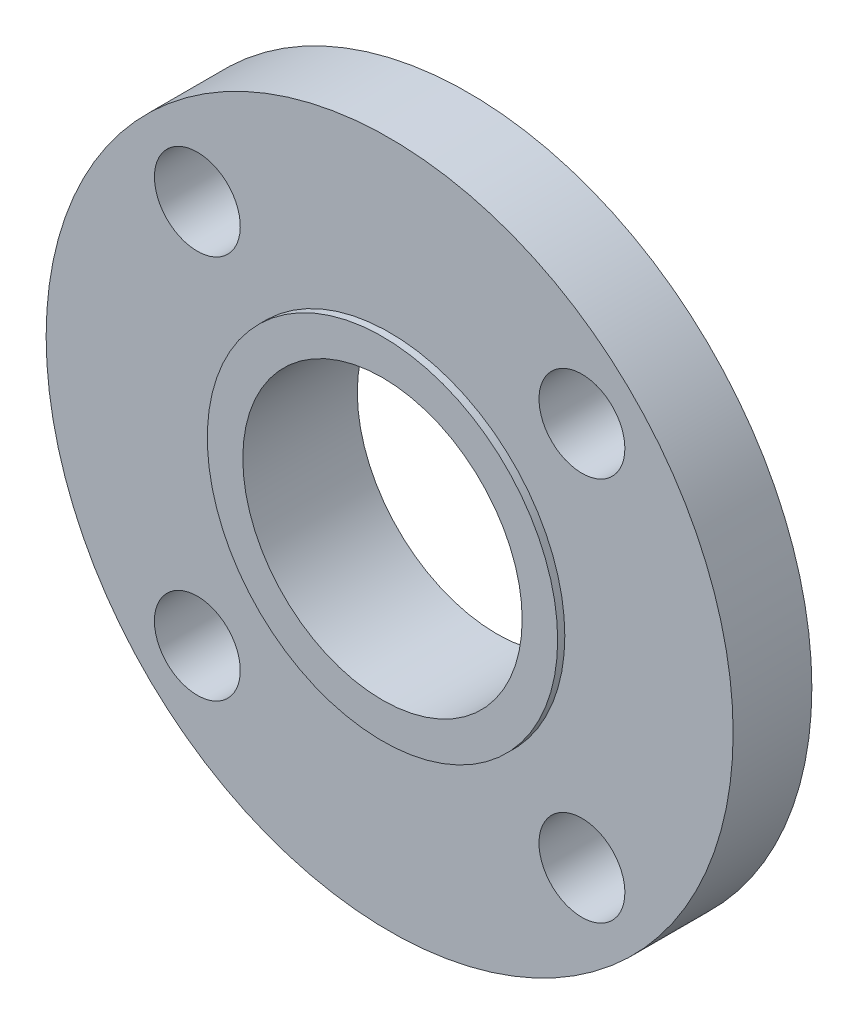
ISO-10303-21;
HEADER;
FILE_DESCRIPTION(('STEP AP214'),'2;1');
FILE_NAME('part.step','',(''),(''),'','','');
FILE_SCHEMA(('AUTOMOTIVE_DESIGN { 1 0 10303 214 1 1 1 1 }'));
ENDSEC;
DATA;
#1=APPLICATION_CONTEXT('core data for automotive mechanical design processes');
#2=APPLICATION_PROTOCOL_DEFINITION('international standard','automotive_design',2000,#1);
#3=PRODUCT_CONTEXT('',#1,'mechanical');
#4=PRODUCT('Part','Part','',(#3));
#5=PRODUCT_RELATED_PRODUCT_CATEGORY('part','',(#4));
#6=PRODUCT_DEFINITION_FORMATION('','',#4);
#7=PRODUCT_DEFINITION_CONTEXT('part definition',#1,'design');
#8=PRODUCT_DEFINITION('design','',#6,#7);
#9=PRODUCT_DEFINITION_SHAPE('','',#8);
#10=(LENGTH_UNIT() NAMED_UNIT(*) SI_UNIT(.MILLI.,.METRE.));
#11=(NAMED_UNIT(*) PLANE_ANGLE_UNIT() SI_UNIT($,.RADIAN.));
#12=(NAMED_UNIT(*) SI_UNIT($,.STERADIAN.) SOLID_ANGLE_UNIT());
#13=UNCERTAINTY_MEASURE_WITH_UNIT(LENGTH_MEASURE(1.E-05),#10,'distance_accuracy_value','');
#14=(GEOMETRIC_REPRESENTATION_CONTEXT(3) GLOBAL_UNCERTAINTY_ASSIGNED_CONTEXT((#13)) GLOBAL_UNIT_ASSIGNED_CONTEXT((#10,
#11,#12)) REPRESENTATION_CONTEXT('',''));
#15=CARTESIAN_POINT('',(0.,0.,0.));
#16=DIRECTION('',(0.,0.,1.));
#17=DIRECTION('',(1.,0.,0.));
#18=AXIS2_PLACEMENT_3D('',#15,#16,#17);
#19=CARTESIAN_POINT('',(0.,0.,-25.4));
#20=DIRECTION('',(0.,0.,1.));
#21=DIRECTION('',(1.,0.,0.));
#22=AXIS2_PLACEMENT_3D('',#19,#20,#21);
#23=CYLINDRICAL_SURFACE('',#22,38.862);
#24=CARTESIAN_POINT('',(0.,0.,-1.5875));
#25=DIRECTION('',(0.,0.,1.));
#26=DIRECTION('',(1.,0.,0.));
#27=AXIS2_PLACEMENT_3D('',#24,#25,#26);
#28=CIRCLE('',#27,38.862);
#29=CARTESIAN_POINT('',(38.862,0.,-1.5875));
#30=VERTEX_POINT('',#29);
#31=EDGE_CURVE('E10',#30,#30,#28,.F.);
#32=ORIENTED_EDGE('',*,*,#31,.F.);
#33=EDGE_LOOP('',(#32));
#34=FACE_BOUND('',#33,.T.);
#35=CARTESIAN_POINT('',(0.,0.,0.));
#36=DIRECTION('',(0.,0.,1.));
#37=DIRECTION('',(1.,0.,0.));
#38=AXIS2_PLACEMENT_3D('',#35,#36,#37);
#39=CIRCLE('',#38,38.862);
#40=CARTESIAN_POINT('',(38.862,0.,0.));
#41=VERTEX_POINT('',#40);
#42=EDGE_CURVE('E47',#41,#41,#39,.T.);
#43=ORIENTED_EDGE('',*,*,#42,.F.);
#44=EDGE_LOOP('',(#43));
#45=FACE_BOUND('',#44,.T.);
#46=ADVANCED_FACE('F35',(#34,#45),#23,.T.);
#47=CARTESIAN_POINT('',(0.,0.,0.));
#48=DIRECTION('',(0.,0.,1.));
#49=DIRECTION('',(1.,0.,0.));
#50=AXIS2_PLACEMENT_3D('',#47,#48,#49);
#51=PLANE('',#50);
#52=CARTESIAN_POINT('',(0.,0.,0.));
#53=DIRECTION('',(0.,0.,1.));
#54=DIRECTION('',(1.,0.,0.));
#55=AXIS2_PLACEMENT_3D('',#52,#53,#54);
#56=CIRCLE('',#55,30.988);
#57=CARTESIAN_POINT('',(30.988,0.,0.));
#58=VERTEX_POINT('',#57);
#59=EDGE_CURVE('E55',#58,#58,#56,.T.);
#60=ORIENTED_EDGE('',*,*,#59,.F.);
#61=EDGE_LOOP('',(#60));
#62=FACE_BOUND('',#61,.T.);
#63=ORIENTED_EDGE('',*,*,#42,.T.);
#64=EDGE_LOOP('',(#63));
#65=FACE_BOUND('',#64,.T.);
#66=ADVANCED_FACE('F91',(#62,#65),#51,.T.);
#67=CARTESIAN_POINT('',(0.,0.,-234.57614690566));
#68=DIRECTION('',(0.,0.,1.));
#69=DIRECTION('',(1.,0.,0.));
#70=AXIS2_PLACEMENT_3D('',#67,#68,#69);
#71=CYLINDRICAL_SURFACE('',#70,76.2);
#72=CARTESIAN_POINT('',(0.,0.,-19.05));
#73=DIRECTION('',(0.,0.,1.));
#74=DIRECTION('',(1.,0.,0.));
#75=AXIS2_PLACEMENT_3D('',#72,#73,#74);
#76=CIRCLE('',#75,76.2);
#77=CARTESIAN_POINT('',(76.2,0.,-19.05));
#78=VERTEX_POINT('',#77);
#79=EDGE_CURVE('E59',#78,#78,#76,.F.);
#80=CARTESIAN_POINT('',(0.,0.,-1.5875));
#81=DIRECTION('',(0.,0.,1.));
#82=DIRECTION('',(1.,0.,0.));
#83=AXIS2_PLACEMENT_3D('',#80,#81,#82);
#84=CIRCLE('',#83,76.2);
#85=CARTESIAN_POINT('',(76.2,0.,-1.58750000000002));
#86=VERTEX_POINT('',#85);
#87=EDGE_CURVE('E54',#86,#86,#84,.T.);
#88=CARTESIAN_POINT('',(76.2,0.,-19.05));
#89=CARTESIAN_POINT('',(76.2,0.,-18.8680989583333));
#90=CARTESIAN_POINT('',(76.2,0.,-18.6861979166667));
#91=CARTESIAN_POINT('',(76.2,0.,-18.3223958333333));
#92=CARTESIAN_POINT('',(76.2,0.,-18.1404947916667));
#93=CARTESIAN_POINT('',(76.2,0.,-17.7766927083333));
#94=CARTESIAN_POINT('',(76.2,0.,-17.5947916666667));
#95=CARTESIAN_POINT('',(76.2,0.,-17.2309895833333));
#96=CARTESIAN_POINT('',(76.2,0.,-17.0490885416667));
#97=CARTESIAN_POINT('',(76.2,0.,-16.6852864583333));
#98=CARTESIAN_POINT('',(76.2,0.,-16.5033854166667));
#99=CARTESIAN_POINT('',(76.2,0.,-16.1395833333333));
#100=CARTESIAN_POINT('',(76.2,0.,-15.9576822916667));
#101=CARTESIAN_POINT('',(76.2,0.,-15.5938802083333));
#102=CARTESIAN_POINT('',(76.2,0.,-15.4119791666667));
#103=CARTESIAN_POINT('',(76.2,0.,-15.0481770833334));
#104=CARTESIAN_POINT('',(76.2,0.,-14.8662760416667));
#105=CARTESIAN_POINT('',(76.2,0.,-14.5024739583334));
#106=CARTESIAN_POINT('',(76.2,0.,-14.3205729166667));
#107=CARTESIAN_POINT('',(76.2,0.,-13.9567708333333));
#108=CARTESIAN_POINT('',(76.2,0.,-13.7748697916667));
#109=CARTESIAN_POINT('',(76.2,0.,-13.4110677083334));
#110=CARTESIAN_POINT('',(76.2,0.,-13.2291666666667));
#111=CARTESIAN_POINT('',(76.2,0.,-12.8653645833334));
#112=CARTESIAN_POINT('',(76.2,0.,-12.6834635416667));
#113=CARTESIAN_POINT('',(76.2,0.,-12.3196614583333));
#114=CARTESIAN_POINT('',(76.2,0.,-12.1377604166667));
#115=CARTESIAN_POINT('',(76.2,0.,-11.7739583333334));
#116=CARTESIAN_POINT('',(76.2,0.,-11.5920572916667));
#117=CARTESIAN_POINT('',(76.2,0.,-11.2282552083334));
#118=CARTESIAN_POINT('',(76.2,0.,-11.0463541666667));
#119=CARTESIAN_POINT('',(76.2,0.,-10.6825520833333));
#120=CARTESIAN_POINT('',(76.2,0.,-10.5006510416667));
#121=CARTESIAN_POINT('',(76.2,0.,-10.1368489583334));
#122=CARTESIAN_POINT('',(76.2,0.,-9.95494791666669));
#123=CARTESIAN_POINT('',(76.2,0.,-9.59114583333335));
#124=CARTESIAN_POINT('',(76.2,0.,-9.40924479166668));
#125=CARTESIAN_POINT('',(76.2,0.,-9.04544270833334));
#126=CARTESIAN_POINT('',(76.2,0.,-8.86354166666668));
#127=CARTESIAN_POINT('',(76.2,0.,-8.49973958333335));
#128=CARTESIAN_POINT('',(76.2,0.,-8.31783854166669));
#129=CARTESIAN_POINT('',(76.2,0.,-7.95403645833335));
#130=CARTESIAN_POINT('',(76.2,0.,-7.77213541666668));
#131=CARTESIAN_POINT('',(76.2,0.,-7.40833333333334));
#132=CARTESIAN_POINT('',(76.2,0.,-7.22643229166668));
#133=CARTESIAN_POINT('',(76.2,0.,-6.86263020833335));
#134=CARTESIAN_POINT('',(76.2,0.,-6.68072916666669));
#135=CARTESIAN_POINT('',(76.2,0.,-6.31692708333335));
#136=CARTESIAN_POINT('',(76.2,0.,-6.13502604166668));
#137=CARTESIAN_POINT('',(76.2,0.,-5.77122395833334));
#138=CARTESIAN_POINT('',(76.2,0.,-5.58932291666668));
#139=CARTESIAN_POINT('',(76.2,0.,-5.22552083333335));
#140=CARTESIAN_POINT('',(76.2,0.,-5.04361979166669));
#141=CARTESIAN_POINT('',(76.2,0.,-4.67981770833336));
#142=CARTESIAN_POINT('',(76.2,0.,-4.49791666666669));
#143=CARTESIAN_POINT('',(76.2,0.,-4.13411458333336));
#144=CARTESIAN_POINT('',(76.2,0.,-3.95221354166668));
#145=CARTESIAN_POINT('',(76.2,0.,-3.58841145833335));
#146=CARTESIAN_POINT('',(76.2,0.,-3.40651041666668));
#147=CARTESIAN_POINT('',(76.2,0.,-3.04270833333336));
#148=CARTESIAN_POINT('',(76.2,0.,-2.86080729166669));
#149=CARTESIAN_POINT('',(76.2,0.,-2.49700520833336));
#150=CARTESIAN_POINT('',(76.2,0.,-2.31510416666668));
#151=CARTESIAN_POINT('',(76.2,0.,-1.95130208333335));
#152=CARTESIAN_POINT('',(76.2,0.,-1.76940104166668));
#153=CARTESIAN_POINT('',(76.2,0.,-1.58750000000002));
#154=B_SPLINE_CURVE_WITH_KNOTS('',3,(#88,#89,#90,#91,#92,#93,#94,#95,#96,#97,#98,#99,#100,#101,
#102,#103,#104,#105,#106,#107,#108,#109,#110,#111,#112,#113,#114,#115,#116,#117,#118,#119,#120,
#121,#122,#123,#124,#125,#126,#127,#128,#129,#130,#131,#132,#133,#134,#135,#136,#137,#138,#139,
#140,#141,#142,#143,#144,#145,#146,#147,#148,#149,#150,#151,#152,#153),.UNSPECIFIED.,.F.,.F.,(4,
2,2,2,2,2,2,2,2,2,2,2,2,2,2,2,2,2,2,2,2,2,2,2,2,2,2,2,2,2,2,2,4),(0.,0.545703124999991,
1.09140625000001,1.637109375,2.18281249999999,2.72851562500001,3.27421875,3.81992187499999,
4.36562499999998,4.911328125,5.45703124999999,6.00273437499999,6.5484375,7.094140625,
7.63984374999999,8.18554687500001,8.73125,9.27695312499999,9.82265625,10.368359375,10.9140625,
11.459765625,12.00546875,12.551171875,13.096875,13.642578125,14.18828125,14.733984375,
15.2796875,15.825390625,16.37109375,16.916796875,17.4625),.UNSPECIFIED.);
#155=EDGE_CURVE('BSEAM88',#78,#86,#154,.T.);
#156=ORIENTED_EDGE('',*,*,#79,.F.);
#157=ORIENTED_EDGE('',*,*,#87,.F.);
#158=ORIENTED_EDGE('',*,*,#155,.T.);
#159=ORIENTED_EDGE('',*,*,#155,.F.);
#160=EDGE_LOOP('',(#156,#158,#157,#159));
#161=FACE_BOUND('',#160,.T.);
#162=ADVANCED_FACE('F88',(#161),#71,.T.);
#163=CARTESIAN_POINT('',(0.,0.,-1.5875));
#164=DIRECTION('',(0.,0.,1.));
#165=DIRECTION('',(1.,0.,0.));
#166=AXIS2_PLACEMENT_3D('',#163,#164,#165);
#167=PLANE('',#166);
#168=CARTESIAN_POINT('',(42.6562165750788,-42.6562165750781,-1.5875));
#169=DIRECTION('',(0.,0.,1.));
#170=DIRECTION('',(0.,-1.,0.));
#171=AXIS2_PLACEMENT_3D('',#168,#169,#170);
#172=CIRCLE('',#171,9.525);
#173=CARTESIAN_POINT('',(42.6562165750789,-52.1812165750781,-1.5875));
#174=VERTEX_POINT('',#173);
#175=EDGE_CURVE('E249',#174,#174,#172,.T.);
#176=ORIENTED_EDGE('',*,*,#175,.F.);
#177=EDGE_LOOP('',(#176));
#178=FACE_BOUND('',#177,.T.);
#179=CARTESIAN_POINT('',(-42.6562165750782,-42.6562165750787,-1.5875));
#180=DIRECTION('',(0.,0.,1.));
#181=DIRECTION('',(-1.,0.,0.));
#182=AXIS2_PLACEMENT_3D('',#179,#180,#181);
#183=CIRCLE('',#182,9.525);
#184=CARTESIAN_POINT('',(-52.1812165750782,-42.6562165750788,-1.5875));
#185=VERTEX_POINT('',#184);
#186=EDGE_CURVE('E243',#185,#185,#183,.T.);
#187=ORIENTED_EDGE('',*,*,#186,.F.);
#188=EDGE_LOOP('',(#187));
#189=FACE_BOUND('',#188,.T.);
#190=CARTESIAN_POINT('',(-42.6562165750785,42.6562165750784,-1.5875));
#191=DIRECTION('',(0.,0.,1.));
#192=DIRECTION('',(0.,1.,0.));
#193=AXIS2_PLACEMENT_3D('',#190,#191,#192);
#194=CIRCLE('',#193,9.525);
#195=CARTESIAN_POINT('',(-42.6562165750786,52.1812165750784,-1.5875));
#196=VERTEX_POINT('',#195);
#197=EDGE_CURVE('E234',#196,#196,#194,.T.);
#198=ORIENTED_EDGE('',*,*,#197,.F.);
#199=EDGE_LOOP('',(#198));
#200=FACE_BOUND('',#199,.T.);
#201=CARTESIAN_POINT('',(42.6562165750785,42.6562165750784,-1.5875));
#202=DIRECTION('',(0.,0.,1.));
#203=DIRECTION('',(1.,0.,0.));
#204=AXIS2_PLACEMENT_3D('',#201,#202,#203);
#205=CIRCLE('',#204,9.525);
#206=CARTESIAN_POINT('',(52.1812165750785,42.6562165750784,-1.5875));
#207=VERTEX_POINT('',#206);
#208=EDGE_CURVE('E66',#207,#207,#205,.T.);
#209=ORIENTED_EDGE('',*,*,#208,.F.);
#210=EDGE_LOOP('',(#209));
#211=FACE_BOUND('',#210,.T.);
#212=ORIENTED_EDGE('',*,*,#31,.T.);
#213=EDGE_LOOP('',(#212));
#214=FACE_BOUND('',#213,.T.);
#215=ORIENTED_EDGE('',*,*,#87,.T.);
#216=EDGE_LOOP('',(#215));
#217=FACE_BOUND('',#216,.T.);
#218=ADVANCED_FACE('F83',(#178,#189,#200,#211,#214,#217),#167,.T.);
#219=CARTESIAN_POINT('',(0.,0.,-19.05));
#220=DIRECTION('',(0.,0.,1.));
#221=DIRECTION('',(1.,0.,0.));
#222=AXIS2_PLACEMENT_3D('',#219,#220,#221);
#223=PLANE('',#222);
#224=CARTESIAN_POINT('',(42.6562165750788,-42.6562165750781,-19.05));
#225=DIRECTION('',(0.,0.,1.));
#226=DIRECTION('',(0.,-1.,0.));
#227=AXIS2_PLACEMENT_3D('',#224,#225,#226);
#228=CIRCLE('',#227,9.525);
#229=CARTESIAN_POINT('',(42.6562165750789,-52.1812165750781,-19.05));
#230=VERTEX_POINT('',#229);
#231=EDGE_CURVE('E246',#230,#230,#228,.T.);
#232=ORIENTED_EDGE('',*,*,#231,.T.);
#233=EDGE_LOOP('',(#232));
#234=FACE_BOUND('',#233,.T.);
#235=CARTESIAN_POINT('',(-42.6562165750782,-42.6562165750787,-19.05));
#236=DIRECTION('',(0.,0.,1.));
#237=DIRECTION('',(-1.,0.,0.));
#238=AXIS2_PLACEMENT_3D('',#235,#236,#237);
#239=CIRCLE('',#238,9.525);
#240=CARTESIAN_POINT('',(-52.1812165750782,-42.6562165750788,-19.05));
#241=VERTEX_POINT('',#240);
#242=EDGE_CURVE('E238',#241,#241,#239,.T.);
#243=ORIENTED_EDGE('',*,*,#242,.T.);
#244=EDGE_LOOP('',(#243));
#245=FACE_BOUND('',#244,.T.);
#246=CARTESIAN_POINT('',(-42.6562165750785,42.6562165750784,-19.05));
#247=DIRECTION('',(0.,0.,1.));
#248=DIRECTION('',(0.,1.,0.));
#249=AXIS2_PLACEMENT_3D('',#246,#247,#248);
#250=CIRCLE('',#249,9.525);
#251=CARTESIAN_POINT('',(-42.6562165750786,52.1812165750784,-19.05));
#252=VERTEX_POINT('',#251);
#253=EDGE_CURVE('E232',#252,#252,#250,.T.);
#254=ORIENTED_EDGE('',*,*,#253,.T.);
#255=EDGE_LOOP('',(#254));
#256=FACE_BOUND('',#255,.T.);
#257=CARTESIAN_POINT('',(42.6562165750785,42.6562165750784,-19.05));
#258=DIRECTION('',(0.,0.,1.));
#259=DIRECTION('',(1.,0.,0.));
#260=AXIS2_PLACEMENT_3D('',#257,#258,#259);
#261=CIRCLE('',#260,9.525);
#262=CARTESIAN_POINT('',(52.1812165750785,42.6562165750784,-19.05));
#263=VERTEX_POINT('',#262);
#264=EDGE_CURVE('E38',#263,#263,#261,.T.);
#265=ORIENTED_EDGE('',*,*,#264,.T.);
#266=EDGE_LOOP('',(#265));
#267=FACE_BOUND('',#266,.T.);
#268=CARTESIAN_POINT('',(0.,0.,-19.05));
#269=DIRECTION('',(0.,0.,1.));
#270=DIRECTION('',(1.,0.,0.));
#271=AXIS2_PLACEMENT_3D('',#268,#269,#270);
#272=CIRCLE('',#271,38.862);
#273=CARTESIAN_POINT('',(38.862,0.,-19.05));
#274=VERTEX_POINT('',#273);
#275=EDGE_CURVE('E50',#274,#274,#272,.F.);
#276=ORIENTED_EDGE('',*,*,#275,.F.);
#277=EDGE_LOOP('',(#276));
#278=FACE_BOUND('',#277,.T.);
#279=ORIENTED_EDGE('',*,*,#79,.T.);
#280=EDGE_LOOP('',(#279));
#281=FACE_BOUND('',#280,.T.);
#282=ADVANCED_FACE('F79',(#234,#245,#256,#267,#278,#281),#223,.F.);
#283=CARTESIAN_POINT('',(0.,0.,-25.4));
#284=DIRECTION('',(0.,0.,1.));
#285=DIRECTION('',(1.,0.,0.));
#286=AXIS2_PLACEMENT_3D('',#283,#284,#285);
#287=PLANE('',#286);
#288=CARTESIAN_POINT('',(0.,0.,-25.4));
#289=DIRECTION('',(0.,0.,1.));
#290=DIRECTION('',(1.,0.,0.));
#291=AXIS2_PLACEMENT_3D('',#288,#289,#290);
#292=CIRCLE('',#291,30.988);
#293=CARTESIAN_POINT('',(30.988,0.,-25.4));
#294=VERTEX_POINT('',#293);
#295=EDGE_CURVE('E52',#294,#294,#292,.T.);
#296=ORIENTED_EDGE('',*,*,#295,.T.);
#297=EDGE_LOOP('',(#296));
#298=FACE_BOUND('',#297,.T.);
#299=CARTESIAN_POINT('',(0.,0.,-25.4));
#300=DIRECTION('',(0.,0.,1.));
#301=DIRECTION('',(1.,0.,0.));
#302=AXIS2_PLACEMENT_3D('',#299,#300,#301);
#303=CIRCLE('',#302,38.862);
#304=CARTESIAN_POINT('',(38.862,0.,-25.4));
#305=VERTEX_POINT('',#304);
#306=EDGE_CURVE('E42',#305,#305,#303,.T.);
#307=ORIENTED_EDGE('',*,*,#306,.F.);
#308=EDGE_LOOP('',(#307));
#309=FACE_BOUND('',#308,.T.);
#310=ADVANCED_FACE('F82',(#298,#309),#287,.F.);
#311=ORIENTED_EDGE('',*,*,#306,.T.);
#312=EDGE_LOOP('',(#311));
#313=FACE_BOUND('',#312,.T.);
#314=ORIENTED_EDGE('',*,*,#275,.T.);
#315=EDGE_LOOP('',(#314));
#316=FACE_BOUND('',#315,.T.);
#317=ADVANCED_FACE('F77',(#313,#316),#23,.T.);
#318=CARTESIAN_POINT('',(0.,0.,19.5213114803758));
#319=DIRECTION('',(0.,0.,1.));
#320=DIRECTION('',(1.,0.,0.));
#321=AXIS2_PLACEMENT_3D('',#318,#319,#320);
#322=CYLINDRICAL_SURFACE('',#321,30.988);
#323=ORIENTED_EDGE('',*,*,#59,.T.);
#324=EDGE_LOOP('',(#323));
#325=FACE_BOUND('',#324,.T.);
#326=ORIENTED_EDGE('',*,*,#295,.F.);
#327=EDGE_LOOP('',(#326));
#328=FACE_BOUND('',#327,.T.);
#329=ADVANCED_FACE('F110',(#325,#328),#322,.F.);
#330=CARTESIAN_POINT('',(42.6562165750785,42.6562165750784,-25.4));
#331=DIRECTION('',(0.,0.,1.));
#332=DIRECTION('',(1.,0.,0.));
#333=AXIS2_PLACEMENT_3D('',#330,#331,#332);
#334=CYLINDRICAL_SURFACE('',#333,9.525);
#335=ORIENTED_EDGE('',*,*,#208,.T.);
#336=EDGE_LOOP('',(#335));
#337=FACE_BOUND('',#336,.T.);
#338=ORIENTED_EDGE('',*,*,#264,.F.);
#339=EDGE_LOOP('',(#338));
#340=FACE_BOUND('',#339,.T.);
#341=ADVANCED_FACE('F116',(#337,#340),#334,.F.);
#342=CARTESIAN_POINT('',(-42.6562165750785,42.6562165750784,-25.4));
#343=DIRECTION('',(0.,0.,1.));
#344=DIRECTION('',(0.,1.,0.));
#345=AXIS2_PLACEMENT_3D('',#342,#343,#344);
#346=CYLINDRICAL_SURFACE('',#345,9.525);
#347=ORIENTED_EDGE('',*,*,#197,.T.);
#348=EDGE_LOOP('',(#347));
#349=FACE_BOUND('',#348,.T.);
#350=ORIENTED_EDGE('',*,*,#253,.F.);
#351=EDGE_LOOP('',(#350));
#352=FACE_BOUND('',#351,.T.);
#353=ADVANCED_FACE('F139',(#349,#352),#346,.F.);
#354=CARTESIAN_POINT('',(-42.6562165750782,-42.6562165750787,-25.4));
#355=DIRECTION('',(0.,0.,1.));
#356=DIRECTION('',(-1.,0.,0.));
#357=AXIS2_PLACEMENT_3D('',#354,#355,#356);
#358=CYLINDRICAL_SURFACE('',#357,9.525);
#359=ORIENTED_EDGE('',*,*,#186,.T.);
#360=EDGE_LOOP('',(#359));
#361=FACE_BOUND('',#360,.T.);
#362=ORIENTED_EDGE('',*,*,#242,.F.);
#363=EDGE_LOOP('',(#362));
#364=FACE_BOUND('',#363,.T.);
#365=ADVANCED_FACE('F144',(#361,#364),#358,.F.);
#366=CARTESIAN_POINT('',(42.6562165750788,-42.6562165750781,-25.4));
#367=DIRECTION('',(0.,0.,1.));
#368=DIRECTION('',(0.,-1.,0.));
#369=AXIS2_PLACEMENT_3D('',#366,#367,#368);
#370=CYLINDRICAL_SURFACE('',#369,9.525);
#371=ORIENTED_EDGE('',*,*,#175,.T.);
#372=EDGE_LOOP('',(#371));
#373=FACE_BOUND('',#372,.T.);
#374=ORIENTED_EDGE('',*,*,#231,.F.);
#375=EDGE_LOOP('',(#374));
#376=FACE_BOUND('',#375,.T.);
#377=ADVANCED_FACE('F157',(#373,#376),#370,.F.);
#378=CLOSED_SHELL('',(#46,#66,#162,#218,#282,#310,#317,#329,#341,#353,#365,#377));
#379=MANIFOLD_SOLID_BREP('B2',#378);
#380=ADVANCED_BREP_SHAPE_REPRESENTATION('',(#18,#379),#14);
#381=SHAPE_DEFINITION_REPRESENTATION(#9,#380);
ENDSEC;
END-ISO-10303-21;
